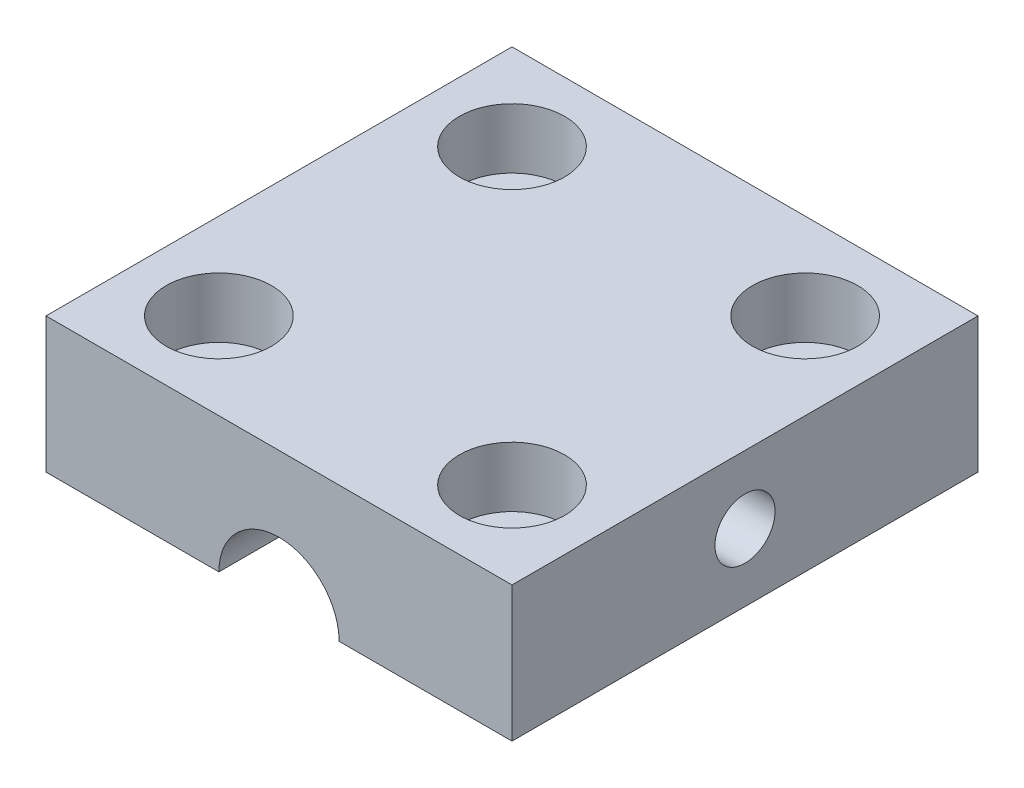
ISO-10303-21;
HEADER;
FILE_DESCRIPTION(('STEP AP214'),'2;1');
FILE_NAME('part.step','',(''),(''),'','','');
FILE_SCHEMA(('AUTOMOTIVE_DESIGN { 1 0 10303 214 1 1 1 1 }'));
ENDSEC;
DATA;
#1=APPLICATION_CONTEXT('core data for automotive mechanical design processes');
#2=APPLICATION_PROTOCOL_DEFINITION('international standard','automotive_design',2000,#1);
#3=PRODUCT_CONTEXT('',#1,'mechanical');
#4=PRODUCT('Part','Part','',(#3));
#5=PRODUCT_RELATED_PRODUCT_CATEGORY('part','',(#4));
#6=PRODUCT_DEFINITION_FORMATION('','',#4);
#7=PRODUCT_DEFINITION_CONTEXT('part definition',#1,'design');
#8=PRODUCT_DEFINITION('design','',#6,#7);
#9=PRODUCT_DEFINITION_SHAPE('','',#8);
#10=(LENGTH_UNIT() NAMED_UNIT(*) SI_UNIT(.MILLI.,.METRE.));
#11=(NAMED_UNIT(*) PLANE_ANGLE_UNIT() SI_UNIT($,.RADIAN.));
#12=(NAMED_UNIT(*) SI_UNIT($,.STERADIAN.) SOLID_ANGLE_UNIT());
#13=UNCERTAINTY_MEASURE_WITH_UNIT(LENGTH_MEASURE(1.E-05),#10,'distance_accuracy_value','');
#14=(GEOMETRIC_REPRESENTATION_CONTEXT(3) GLOBAL_UNCERTAINTY_ASSIGNED_CONTEXT((#13)) GLOBAL_UNIT_ASSIGNED_CONTEXT((#10,
#11,#12)) REPRESENTATION_CONTEXT('',''));
#15=CARTESIAN_POINT('',(0.,0.,0.));
#16=DIRECTION('',(0.,0.,1.));
#17=DIRECTION('',(1.,0.,0.));
#18=AXIS2_PLACEMENT_3D('',#15,#16,#17);
#19=CARTESIAN_POINT('',(-15.5,-4.5,31.));
#20=DIRECTION('',(1.,0.,0.));
#21=DIRECTION('',(0.,0.,-1.));
#22=AXIS2_PLACEMENT_3D('',#19,#20,#21);
#23=PLANE('',#22);
#24=DIRECTION('',(0.,-1.,0.));
#25=VECTOR('',#24,1.);
#26=CARTESIAN_POINT('',(-15.5,-4.5,0.));
#27=LINE('',#26,#25);
#28=CARTESIAN_POINT('',(-15.5,4.5,0.));
#29=VERTEX_POINT('',#28);
#30=CARTESIAN_POINT('',(-15.5,-4.5,0.));
#31=VERTEX_POINT('',#30);
#32=EDGE_CURVE('E136',#29,#31,#27,.T.);
#33=ORIENTED_EDGE('',*,*,#32,.T.);
#34=DIRECTION('',(0.,0.,-1.));
#35=VECTOR('',#34,1.);
#36=CARTESIAN_POINT('',(-15.5,-4.5,31.));
#37=LINE('',#36,#35);
#38=CARTESIAN_POINT('',(-15.5,-4.5,31.));
#39=VERTEX_POINT('',#38);
#40=EDGE_CURVE('E11',#39,#31,#37,.T.);
#41=ORIENTED_EDGE('',*,*,#40,.F.);
#42=DIRECTION('',(0.,-1.,0.));
#43=VECTOR('',#42,1.);
#44=CARTESIAN_POINT('',(-15.5,-4.5,31.));
#45=LINE('',#44,#43);
#46=CARTESIAN_POINT('',(-15.5,4.5,31.));
#47=VERTEX_POINT('',#46);
#48=EDGE_CURVE('E153',#47,#39,#45,.T.);
#49=ORIENTED_EDGE('',*,*,#48,.F.);
#50=DIRECTION('',(0.,0.,-1.));
#51=VECTOR('',#50,1.);
#52=CARTESIAN_POINT('',(-15.5,4.5,31.));
#53=LINE('',#52,#51);
#54=EDGE_CURVE('E132',#47,#29,#53,.T.);
#55=ORIENTED_EDGE('',*,*,#54,.T.);
#56=EDGE_LOOP('',(#33,#41,#49,#55));
#57=FACE_BOUND('',#56,.T.);
#58=ADVANCED_FACE('F45',(#57),#23,.F.);
#59=CARTESIAN_POINT('',(-4.,-4.5,31.));
#60=DIRECTION('',(0.,1.,0.));
#61=DIRECTION('',(0.,0.,1.));
#62=AXIS2_PLACEMENT_3D('',#59,#60,#61);
#63=PLANE('',#62);
#64=CARTESIAN_POINT('',(-9.75,-4.5,25.25));
#65=DIRECTION('',(0.,1.,0.));
#66=DIRECTION('',(0.,0.,1.));
#67=AXIS2_PLACEMENT_3D('',#64,#65,#66);
#68=CIRCLE('',#67,2.);
#69=CARTESIAN_POINT('',(-9.75,-4.5,27.25));
#70=VERTEX_POINT('',#69);
#71=EDGE_CURVE('E274',#70,#70,#68,.T.);
#72=ORIENTED_EDGE('',*,*,#71,.T.);
#73=EDGE_LOOP('',(#72));
#74=FACE_BOUND('',#73,.T.);
#75=CARTESIAN_POINT('',(-9.75,-4.5,5.75));
#76=DIRECTION('',(0.,1.,0.));
#77=DIRECTION('',(0.,0.,1.));
#78=AXIS2_PLACEMENT_3D('',#75,#76,#77);
#79=CIRCLE('',#78,2.);
#80=CARTESIAN_POINT('',(-9.75,-4.5,7.75));
#81=VERTEX_POINT('',#80);
#82=EDGE_CURVE('E271',#81,#81,#79,.T.);
#83=ORIENTED_EDGE('',*,*,#82,.T.);
#84=EDGE_LOOP('',(#83));
#85=FACE_BOUND('',#84,.T.);
#86=DIRECTION('',(1.,0.,0.));
#87=VECTOR('',#86,1.);
#88=CARTESIAN_POINT('',(-4.,-4.5,0.));
#89=LINE('',#88,#87);
#90=CARTESIAN_POINT('',(-4.,-4.5,0.));
#91=VERTEX_POINT('',#90);
#92=EDGE_CURVE('E140',#31,#91,#89,.T.);
#93=ORIENTED_EDGE('',*,*,#92,.T.);
#94=DIRECTION('',(0.,0.,-1.));
#95=VECTOR('',#94,1.);
#96=CARTESIAN_POINT('',(-4.,-4.5,31.));
#97=LINE('',#96,#95);
#98=CARTESIAN_POINT('',(-4.,-4.5,31.));
#99=VERTEX_POINT('',#98);
#100=EDGE_CURVE('E55',#99,#91,#97,.T.);
#101=ORIENTED_EDGE('',*,*,#100,.F.);
#102=DIRECTION('',(1.,0.,0.));
#103=VECTOR('',#102,1.);
#104=CARTESIAN_POINT('',(-4.,-4.5,31.));
#105=LINE('',#104,#103);
#106=EDGE_CURVE('E101',#39,#99,#105,.T.);
#107=ORIENTED_EDGE('',*,*,#106,.F.);
#108=ORIENTED_EDGE('',*,*,#40,.T.);
#109=EDGE_LOOP('',(#93,#101,#107,#108));
#110=FACE_BOUND('',#109,.T.);
#111=ADVANCED_FACE('F221',(#74,#85,#110),#63,.F.);
#112=CARTESIAN_POINT('',(0.,-4.5,31.));
#113=DIRECTION('',(0.,0.,-1.));
#114=DIRECTION('',(-1.,0.,0.));
#115=AXIS2_PLACEMENT_3D('',#112,#113,#114);
#116=CYLINDRICAL_SURFACE('',#115,4.);
#117=CARTESIAN_POINT('',(0.,-4.5,0.));
#118=DIRECTION('',(0.,0.,-1.));
#119=DIRECTION('',(1.,0.,0.));
#120=AXIS2_PLACEMENT_3D('',#117,#118,#119);
#121=CIRCLE('',#120,4.);
#122=CARTESIAN_POINT('',(4.,-4.5,0.));
#123=VERTEX_POINT('',#122);
#124=EDGE_CURVE('E144',#91,#123,#121,.T.);
#125=ORIENTED_EDGE('',*,*,#124,.T.);
#126=DIRECTION('',(0.,0.,-1.));
#127=VECTOR('',#126,1.);
#128=CARTESIAN_POINT('',(4.,-4.5,31.));
#129=LINE('',#128,#127);
#130=CARTESIAN_POINT('',(4.,-4.5,31.));
#131=VERTEX_POINT('',#130);
#132=EDGE_CURVE('E125',#131,#123,#129,.T.);
#133=ORIENTED_EDGE('',*,*,#132,.F.);
#134=CARTESIAN_POINT('',(0.,-4.5,31.));
#135=DIRECTION('',(0.,0.,-1.));
#136=DIRECTION('',(1.,0.,0.));
#137=AXIS2_PLACEMENT_3D('',#134,#135,#136);
#138=CIRCLE('',#137,4.);
#139=EDGE_CURVE('E114',#99,#131,#138,.T.);
#140=ORIENTED_EDGE('',*,*,#139,.F.);
#141=ORIENTED_EDGE('',*,*,#100,.T.);
#142=EDGE_LOOP('',(#125,#133,#140,#141));
#143=FACE_BOUND('',#142,.T.);
#144=ADVANCED_FACE('F224',(#143),#116,.F.);
#145=CARTESIAN_POINT('',(15.5,-4.5,31.));
#146=DIRECTION('',(0.,1.,0.));
#147=DIRECTION('',(0.,0.,1.));
#148=AXIS2_PLACEMENT_3D('',#145,#146,#147);
#149=PLANE('',#148);
#150=CARTESIAN_POINT('',(9.75,-4.5,25.25));
#151=DIRECTION('',(0.,1.,0.));
#152=DIRECTION('',(0.,0.,1.));
#153=AXIS2_PLACEMENT_3D('',#150,#151,#152);
#154=CIRCLE('',#153,2.);
#155=CARTESIAN_POINT('',(9.75,-4.5,27.25));
#156=VERTEX_POINT('',#155);
#157=EDGE_CURVE('E266',#156,#156,#154,.T.);
#158=ORIENTED_EDGE('',*,*,#157,.T.);
#159=EDGE_LOOP('',(#158));
#160=FACE_BOUND('',#159,.T.);
#161=CARTESIAN_POINT('',(9.75,-4.5,5.75));
#162=DIRECTION('',(0.,1.,0.));
#163=DIRECTION('',(0.,0.,1.));
#164=AXIS2_PLACEMENT_3D('',#161,#162,#163);
#165=CIRCLE('',#164,2.);
#166=CARTESIAN_POINT('',(9.75,-4.5,7.75));
#167=VERTEX_POINT('',#166);
#168=EDGE_CURVE('E168',#167,#167,#165,.T.);
#169=ORIENTED_EDGE('',*,*,#168,.T.);
#170=EDGE_LOOP('',(#169));
#171=FACE_BOUND('',#170,.T.);
#172=DIRECTION('',(1.,0.,0.));
#173=VECTOR('',#172,1.);
#174=CARTESIAN_POINT('',(15.5,-4.5,0.));
#175=LINE('',#174,#173);
#176=CARTESIAN_POINT('',(15.5,-4.5,0.));
#177=VERTEX_POINT('',#176);
#178=EDGE_CURVE('E123',#123,#177,#175,.T.);
#179=ORIENTED_EDGE('',*,*,#178,.T.);
#180=DIRECTION('',(0.,0.,-1.));
#181=VECTOR('',#180,1.);
#182=CARTESIAN_POINT('',(15.5,-4.5,31.));
#183=LINE('',#182,#181);
#184=CARTESIAN_POINT('',(15.5,-4.5,31.));
#185=VERTEX_POINT('',#184);
#186=EDGE_CURVE('E120',#185,#177,#183,.T.);
#187=ORIENTED_EDGE('',*,*,#186,.F.);
#188=DIRECTION('',(1.,0.,0.));
#189=VECTOR('',#188,1.);
#190=CARTESIAN_POINT('',(15.5,-4.5,31.));
#191=LINE('',#190,#189);
#192=EDGE_CURVE('E108',#131,#185,#191,.T.);
#193=ORIENTED_EDGE('',*,*,#192,.F.);
#194=ORIENTED_EDGE('',*,*,#132,.T.);
#195=EDGE_LOOP('',(#179,#187,#193,#194));
#196=FACE_BOUND('',#195,.T.);
#197=ADVANCED_FACE('F121',(#160,#171,#196),#149,.F.);
#198=CARTESIAN_POINT('',(15.5,-4.5,31.));
#199=DIRECTION('',(-1.,0.,0.));
#200=DIRECTION('',(0.,0.,1.));
#201=AXIS2_PLACEMENT_3D('',#198,#199,#200);
#202=PLANE('',#201);
#203=CARTESIAN_POINT('',(15.5,0.,15.5));
#204=DIRECTION('',(1.,0.,0.));
#205=DIRECTION('',(0.,0.,-1.));
#206=AXIS2_PLACEMENT_3D('',#203,#204,#205);
#207=CIRCLE('',#206,2.);
#208=CARTESIAN_POINT('',(15.5,0.,13.5));
#209=VERTEX_POINT('',#208);
#210=EDGE_CURVE('E282',#209,#209,#207,.T.);
#211=ORIENTED_EDGE('',*,*,#210,.F.);
#212=EDGE_LOOP('',(#211));
#213=FACE_BOUND('',#212,.T.);
#214=DIRECTION('',(0.,1.,0.));
#215=VECTOR('',#214,1.);
#216=CARTESIAN_POINT('',(15.5,-4.5,0.));
#217=LINE('',#216,#215);
#218=CARTESIAN_POINT('',(15.5,4.5,0.));
#219=VERTEX_POINT('',#218);
#220=EDGE_CURVE('E87',#177,#219,#217,.T.);
#221=ORIENTED_EDGE('',*,*,#220,.T.);
#222=DIRECTION('',(0.,0.,-1.));
#223=VECTOR('',#222,1.);
#224=CARTESIAN_POINT('',(15.5,4.5,31.));
#225=LINE('',#224,#223);
#226=CARTESIAN_POINT('',(15.5,4.5,31.));
#227=VERTEX_POINT('',#226);
#228=EDGE_CURVE('E126',#227,#219,#225,.T.);
#229=ORIENTED_EDGE('',*,*,#228,.F.);
#230=DIRECTION('',(0.,1.,0.));
#231=VECTOR('',#230,1.);
#232=CARTESIAN_POINT('',(15.5,-4.5,31.));
#233=LINE('',#232,#231);
#234=EDGE_CURVE('E112',#185,#227,#233,.T.);
#235=ORIENTED_EDGE('',*,*,#234,.F.);
#236=ORIENTED_EDGE('',*,*,#186,.T.);
#237=EDGE_LOOP('',(#221,#229,#235,#236));
#238=FACE_BOUND('',#237,.T.);
#239=ADVANCED_FACE('F128',(#213,#238),#202,.F.);
#240=CARTESIAN_POINT('',(15.5,4.5,31.));
#241=DIRECTION('',(0.,-1.,0.));
#242=DIRECTION('',(0.,0.,-1.));
#243=AXIS2_PLACEMENT_3D('',#240,#241,#242);
#244=PLANE('',#243);
#245=CARTESIAN_POINT('',(9.75,4.5,25.25));
#246=DIRECTION('',(0.,1.,0.));
#247=DIRECTION('',(0.,0.,-1.));
#248=AXIS2_PLACEMENT_3D('',#245,#246,#247);
#249=CIRCLE('',#248,3.5);
#250=CARTESIAN_POINT('',(9.75,4.5,21.75));
#251=VERTEX_POINT('',#250);
#252=EDGE_CURVE('E193',#251,#251,#249,.T.);
#253=ORIENTED_EDGE('',*,*,#252,.F.);
#254=EDGE_LOOP('',(#253));
#255=FACE_BOUND('',#254,.T.);
#256=CARTESIAN_POINT('',(-9.75,4.5,5.75));
#257=DIRECTION('',(0.,1.,0.));
#258=DIRECTION('',(0.,0.,-1.));
#259=AXIS2_PLACEMENT_3D('',#256,#257,#258);
#260=CIRCLE('',#259,3.5);
#261=CARTESIAN_POINT('',(-9.75,4.5,2.25));
#262=VERTEX_POINT('',#261);
#263=EDGE_CURVE('E202',#262,#262,#260,.T.);
#264=ORIENTED_EDGE('',*,*,#263,.F.);
#265=EDGE_LOOP('',(#264));
#266=FACE_BOUND('',#265,.T.);
#267=CARTESIAN_POINT('',(-9.75,4.5,25.25));
#268=DIRECTION('',(0.,1.,0.));
#269=DIRECTION('',(0.,0.,1.));
#270=AXIS2_PLACEMENT_3D('',#267,#268,#269);
#271=CIRCLE('',#270,3.5);
#272=CARTESIAN_POINT('',(-9.75,4.5,28.75));
#273=VERTEX_POINT('',#272);
#274=EDGE_CURVE('E183',#273,#273,#271,.T.);
#275=ORIENTED_EDGE('',*,*,#274,.F.);
#276=EDGE_LOOP('',(#275));
#277=FACE_BOUND('',#276,.T.);
#278=CARTESIAN_POINT('',(9.75,4.5,5.75));
#279=DIRECTION('',(0.,1.,0.));
#280=DIRECTION('',(0.,0.,1.));
#281=AXIS2_PLACEMENT_3D('',#278,#279,#280);
#282=CIRCLE('',#281,3.5);
#283=CARTESIAN_POINT('',(9.75,4.5,9.25));
#284=VERTEX_POINT('',#283);
#285=EDGE_CURVE('E197',#284,#284,#282,.T.);
#286=ORIENTED_EDGE('',*,*,#285,.F.);
#287=EDGE_LOOP('',(#286));
#288=FACE_BOUND('',#287,.T.);
#289=DIRECTION('',(-1.,0.,0.));
#290=VECTOR('',#289,1.);
#291=CARTESIAN_POINT('',(15.5,4.5,0.));
#292=LINE('',#291,#290);
#293=EDGE_CURVE('E93',#219,#29,#292,.T.);
#294=ORIENTED_EDGE('',*,*,#293,.T.);
#295=ORIENTED_EDGE('',*,*,#54,.F.);
#296=DIRECTION('',(-1.,0.,0.));
#297=VECTOR('',#296,1.);
#298=CARTESIAN_POINT('',(15.5,4.5,31.));
#299=LINE('',#298,#297);
#300=EDGE_CURVE('E64',#227,#47,#299,.T.);
#301=ORIENTED_EDGE('',*,*,#300,.F.);
#302=ORIENTED_EDGE('',*,*,#228,.T.);
#303=EDGE_LOOP('',(#294,#295,#301,#302));
#304=FACE_BOUND('',#303,.T.);
#305=ADVANCED_FACE('F229',(#255,#266,#277,#288,#304),#244,.F.);
#306=CARTESIAN_POINT('',(0.,-4.5,31.));
#307=DIRECTION('',(0.,0.,1.));
#308=DIRECTION('',(1.,0.,0.));
#309=AXIS2_PLACEMENT_3D('',#306,#307,#308);
#310=PLANE('',#309);
#311=ORIENTED_EDGE('',*,*,#48,.T.);
#312=ORIENTED_EDGE('',*,*,#106,.T.);
#313=ORIENTED_EDGE('',*,*,#139,.T.);
#314=ORIENTED_EDGE('',*,*,#192,.T.);
#315=ORIENTED_EDGE('',*,*,#234,.T.);
#316=ORIENTED_EDGE('',*,*,#300,.T.);
#317=EDGE_LOOP('',(#311,#312,#313,#314,#315,#316));
#318=FACE_BOUND('',#317,.T.);
#319=ADVANCED_FACE('F110',(#318),#310,.T.);
#320=CARTESIAN_POINT('',(0.,-4.5,0.));
#321=DIRECTION('',(0.,0.,1.));
#322=DIRECTION('',(1.,0.,0.));
#323=AXIS2_PLACEMENT_3D('',#320,#321,#322);
#324=PLANE('',#323);
#325=ORIENTED_EDGE('',*,*,#32,.F.);
#326=ORIENTED_EDGE('',*,*,#293,.F.);
#327=ORIENTED_EDGE('',*,*,#220,.F.);
#328=ORIENTED_EDGE('',*,*,#178,.F.);
#329=ORIENTED_EDGE('',*,*,#124,.F.);
#330=ORIENTED_EDGE('',*,*,#92,.F.);
#331=EDGE_LOOP('',(#325,#326,#327,#328,#329,#330));
#332=FACE_BOUND('',#331,.T.);
#333=ADVANCED_FACE('F227',(#332),#324,.F.);
#334=CARTESIAN_POINT('',(9.75,0.5,5.75));
#335=DIRECTION('',(0.,1.,0.));
#336=DIRECTION('',(0.,0.,1.));
#337=AXIS2_PLACEMENT_3D('',#334,#335,#336);
#338=CYLINDRICAL_SURFACE('',#337,3.5);
#339=CARTESIAN_POINT('',(9.75,0.5,5.75));
#340=DIRECTION('',(0.,1.,0.));
#341=DIRECTION('',(0.,0.,1.));
#342=AXIS2_PLACEMENT_3D('',#339,#340,#341);
#343=CIRCLE('',#342,3.5);
#344=CARTESIAN_POINT('',(9.75,0.5,9.25));
#345=VERTEX_POINT('',#344);
#346=EDGE_CURVE('E141',#345,#345,#343,.T.);
#347=ORIENTED_EDGE('',*,*,#346,.F.);
#348=EDGE_LOOP('',(#347));
#349=FACE_BOUND('',#348,.T.);
#350=ORIENTED_EDGE('',*,*,#285,.T.);
#351=EDGE_LOOP('',(#350));
#352=FACE_BOUND('',#351,.T.);
#353=ADVANCED_FACE('F341',(#349,#352),#338,.F.);
#354=CARTESIAN_POINT('',(9.75,0.5,5.75));
#355=DIRECTION('',(0.,1.,0.));
#356=DIRECTION('',(0.,0.,1.));
#357=AXIS2_PLACEMENT_3D('',#354,#355,#356);
#358=PLANE('',#357);
#359=CARTESIAN_POINT('',(9.75,0.5,5.75));
#360=DIRECTION('',(0.,1.,0.));
#361=DIRECTION('',(0.,0.,1.));
#362=AXIS2_PLACEMENT_3D('',#359,#360,#361);
#363=CIRCLE('',#362,2.);
#364=CARTESIAN_POINT('',(9.75,0.5,7.75));
#365=VERTEX_POINT('',#364);
#366=EDGE_CURVE('E48',#365,#365,#363,.T.);
#367=ORIENTED_EDGE('',*,*,#366,.F.);
#368=EDGE_LOOP('',(#367));
#369=FACE_BOUND('',#368,.T.);
#370=ORIENTED_EDGE('',*,*,#346,.T.);
#371=EDGE_LOOP('',(#370));
#372=FACE_BOUND('',#371,.T.);
#373=ADVANCED_FACE('F321',(#369,#372),#358,.T.);
#374=CARTESIAN_POINT('',(-9.75,0.5,25.25));
#375=DIRECTION('',(0.,1.,0.));
#376=DIRECTION('',(0.,0.,1.));
#377=AXIS2_PLACEMENT_3D('',#374,#375,#376);
#378=CYLINDRICAL_SURFACE('',#377,3.5);
#379=CARTESIAN_POINT('',(-9.75,0.5,25.25));
#380=DIRECTION('',(0.,1.,0.));
#381=DIRECTION('',(0.,0.,1.));
#382=AXIS2_PLACEMENT_3D('',#379,#380,#381);
#383=CIRCLE('',#382,3.5);
#384=CARTESIAN_POINT('',(-9.75,0.5,28.75));
#385=VERTEX_POINT('',#384);
#386=EDGE_CURVE('E178',#385,#385,#383,.T.);
#387=ORIENTED_EDGE('',*,*,#386,.F.);
#388=EDGE_LOOP('',(#387));
#389=FACE_BOUND('',#388,.T.);
#390=ORIENTED_EDGE('',*,*,#274,.T.);
#391=EDGE_LOOP('',(#390));
#392=FACE_BOUND('',#391,.T.);
#393=ADVANCED_FACE('F317',(#389,#392),#378,.F.);
#394=CARTESIAN_POINT('',(-9.75,0.5,25.25));
#395=DIRECTION('',(0.,1.,0.));
#396=DIRECTION('',(0.,0.,1.));
#397=AXIS2_PLACEMENT_3D('',#394,#395,#396);
#398=PLANE('',#397);
#399=CARTESIAN_POINT('',(-9.75,0.5,25.25));
#400=DIRECTION('',(0.,1.,0.));
#401=DIRECTION('',(0.,0.,1.));
#402=AXIS2_PLACEMENT_3D('',#399,#400,#401);
#403=CIRCLE('',#402,2.);
#404=CARTESIAN_POINT('',(-9.75,0.5,27.25));
#405=VERTEX_POINT('',#404);
#406=EDGE_CURVE('E171',#405,#405,#403,.T.);
#407=ORIENTED_EDGE('',*,*,#406,.F.);
#408=EDGE_LOOP('',(#407));
#409=FACE_BOUND('',#408,.T.);
#410=ORIENTED_EDGE('',*,*,#386,.T.);
#411=EDGE_LOOP('',(#410));
#412=FACE_BOUND('',#411,.T.);
#413=ADVANCED_FACE('F320',(#409,#412),#398,.T.);
#414=CARTESIAN_POINT('',(-9.75,0.5,5.75));
#415=DIRECTION('',(0.,1.,0.));
#416=DIRECTION('',(0.,0.,1.));
#417=AXIS2_PLACEMENT_3D('',#414,#415,#416);
#418=CYLINDRICAL_SURFACE('',#417,3.5);
#419=CARTESIAN_POINT('',(-9.75,0.5,5.75));
#420=DIRECTION('',(0.,1.,0.));
#421=DIRECTION('',(0.,0.,-1.));
#422=AXIS2_PLACEMENT_3D('',#419,#420,#421);
#423=CIRCLE('',#422,3.5);
#424=CARTESIAN_POINT('',(-9.75,0.5,2.25));
#425=VERTEX_POINT('',#424);
#426=EDGE_CURVE('E189',#425,#425,#423,.T.);
#427=ORIENTED_EDGE('',*,*,#426,.F.);
#428=EDGE_LOOP('',(#427));
#429=FACE_BOUND('',#428,.T.);
#430=ORIENTED_EDGE('',*,*,#263,.T.);
#431=EDGE_LOOP('',(#430));
#432=FACE_BOUND('',#431,.T.);
#433=ADVANCED_FACE('F325',(#429,#432),#418,.F.);
#434=CARTESIAN_POINT('',(-9.75,0.5,5.75));
#435=DIRECTION('',(0.,-1.,0.));
#436=DIRECTION('',(0.,0.,-1.));
#437=AXIS2_PLACEMENT_3D('',#434,#435,#436);
#438=PLANE('',#437);
#439=CARTESIAN_POINT('',(-9.75,0.5,5.75));
#440=DIRECTION('',(0.,-1.,0.));
#441=DIRECTION('',(0.,0.,-1.));
#442=AXIS2_PLACEMENT_3D('',#439,#440,#441);
#443=CIRCLE('',#442,2.);
#444=CARTESIAN_POINT('',(-9.75,0.5,3.75));
#445=VERTEX_POINT('',#444);
#446=EDGE_CURVE('E167',#445,#445,#443,.T.);
#447=ORIENTED_EDGE('',*,*,#446,.T.);
#448=EDGE_LOOP('',(#447));
#449=FACE_BOUND('',#448,.T.);
#450=ORIENTED_EDGE('',*,*,#426,.T.);
#451=EDGE_LOOP('',(#450));
#452=FACE_BOUND('',#451,.T.);
#453=ADVANCED_FACE('F329',(#449,#452),#438,.F.);
#454=CARTESIAN_POINT('',(9.75,0.5,25.25));
#455=DIRECTION('',(0.,1.,0.));
#456=DIRECTION('',(0.,0.,1.));
#457=AXIS2_PLACEMENT_3D('',#454,#455,#456);
#458=CYLINDRICAL_SURFACE('',#457,3.5);
#459=CARTESIAN_POINT('',(9.75,0.5,25.25));
#460=DIRECTION('',(0.,1.,0.));
#461=DIRECTION('',(0.,0.,-1.));
#462=AXIS2_PLACEMENT_3D('',#459,#460,#461);
#463=CIRCLE('',#462,3.5);
#464=CARTESIAN_POINT('',(9.75,0.5,21.75));
#465=VERTEX_POINT('',#464);
#466=EDGE_CURVE('E198',#465,#465,#463,.T.);
#467=ORIENTED_EDGE('',*,*,#466,.F.);
#468=EDGE_LOOP('',(#467));
#469=FACE_BOUND('',#468,.T.);
#470=ORIENTED_EDGE('',*,*,#252,.T.);
#471=EDGE_LOOP('',(#470));
#472=FACE_BOUND('',#471,.T.);
#473=ADVANCED_FACE('F327',(#469,#472),#458,.F.);
#474=CARTESIAN_POINT('',(9.75,0.5,25.25));
#475=DIRECTION('',(0.,-1.,0.));
#476=DIRECTION('',(0.,0.,-1.));
#477=AXIS2_PLACEMENT_3D('',#474,#475,#476);
#478=PLANE('',#477);
#479=CARTESIAN_POINT('',(9.75,0.5,25.25));
#480=DIRECTION('',(0.,-1.,0.));
#481=DIRECTION('',(0.,0.,-1.));
#482=AXIS2_PLACEMENT_3D('',#479,#480,#481);
#483=CIRCLE('',#482,2.);
#484=CARTESIAN_POINT('',(9.75,0.5,23.25));
#485=VERTEX_POINT('',#484);
#486=EDGE_CURVE('E163',#485,#485,#483,.T.);
#487=ORIENTED_EDGE('',*,*,#486,.T.);
#488=EDGE_LOOP('',(#487));
#489=FACE_BOUND('',#488,.T.);
#490=ORIENTED_EDGE('',*,*,#466,.T.);
#491=EDGE_LOOP('',(#490));
#492=FACE_BOUND('',#491,.T.);
#493=ADVANCED_FACE('F314',(#489,#492),#478,.F.);
#494=CARTESIAN_POINT('',(9.75,-4.5,25.25));
#495=DIRECTION('',(0.,1.,0.));
#496=DIRECTION('',(0.,0.,1.));
#497=AXIS2_PLACEMENT_3D('',#494,#495,#496);
#498=CYLINDRICAL_SURFACE('',#497,2.);
#499=ORIENTED_EDGE('',*,*,#157,.F.);
#500=EDGE_LOOP('',(#499));
#501=FACE_BOUND('',#500,.T.);
#502=ORIENTED_EDGE('',*,*,#486,.F.);
#503=EDGE_LOOP('',(#502));
#504=FACE_BOUND('',#503,.T.);
#505=ADVANCED_FACE('F309',(#501,#504),#498,.F.);
#506=CARTESIAN_POINT('',(-9.75,-4.5,5.75));
#507=DIRECTION('',(0.,1.,0.));
#508=DIRECTION('',(0.,0.,1.));
#509=AXIS2_PLACEMENT_3D('',#506,#507,#508);
#510=CYLINDRICAL_SURFACE('',#509,2.);
#511=ORIENTED_EDGE('',*,*,#82,.F.);
#512=EDGE_LOOP('',(#511));
#513=FACE_BOUND('',#512,.T.);
#514=ORIENTED_EDGE('',*,*,#446,.F.);
#515=EDGE_LOOP('',(#514));
#516=FACE_BOUND('',#515,.T.);
#517=ADVANCED_FACE('F306',(#513,#516),#510,.F.);
#518=CARTESIAN_POINT('',(-9.75,-4.5,25.25));
#519=DIRECTION('',(0.,1.,0.));
#520=DIRECTION('',(0.,0.,1.));
#521=AXIS2_PLACEMENT_3D('',#518,#519,#520);
#522=CYLINDRICAL_SURFACE('',#521,2.);
#523=ORIENTED_EDGE('',*,*,#406,.T.);
#524=EDGE_LOOP('',(#523));
#525=FACE_BOUND('',#524,.T.);
#526=ORIENTED_EDGE('',*,*,#71,.F.);
#527=EDGE_LOOP('',(#526));
#528=FACE_BOUND('',#527,.T.);
#529=ADVANCED_FACE('F303',(#525,#528),#522,.F.);
#530=CARTESIAN_POINT('',(9.75,-4.5,5.75));
#531=DIRECTION('',(0.,1.,0.));
#532=DIRECTION('',(0.,0.,1.));
#533=AXIS2_PLACEMENT_3D('',#530,#531,#532);
#534=CYLINDRICAL_SURFACE('',#533,2.);
#535=ORIENTED_EDGE('',*,*,#366,.T.);
#536=EDGE_LOOP('',(#535));
#537=FACE_BOUND('',#536,.T.);
#538=ORIENTED_EDGE('',*,*,#168,.F.);
#539=EDGE_LOOP('',(#538));
#540=FACE_BOUND('',#539,.T.);
#541=ADVANCED_FACE('F295',(#537,#540),#534,.F.);
#542=CARTESIAN_POINT('',(5.5,0.,15.5));
#543=DIRECTION('',(1.,0.,0.));
#544=DIRECTION('',(0.,0.,-1.));
#545=AXIS2_PLACEMENT_3D('',#542,#543,#544);
#546=CYLINDRICAL_SURFACE('',#545,2.);
#547=CARTESIAN_POINT('',(5.5,0.,15.5));
#548=DIRECTION('',(1.,0.,0.));
#549=DIRECTION('',(0.,0.,-1.));
#550=AXIS2_PLACEMENT_3D('',#547,#548,#549);
#551=CIRCLE('',#550,2.);
#552=CARTESIAN_POINT('',(5.5,0.,13.5));
#553=VERTEX_POINT('',#552);
#554=EDGE_CURVE('E279',#553,#553,#551,.T.);
#555=ORIENTED_EDGE('',*,*,#554,.F.);
#556=EDGE_LOOP('',(#555));
#557=FACE_BOUND('',#556,.T.);
#558=ORIENTED_EDGE('',*,*,#210,.T.);
#559=EDGE_LOOP('',(#558));
#560=FACE_BOUND('',#559,.T.);
#561=ADVANCED_FACE('F292',(#557,#560),#546,.F.);
#562=CARTESIAN_POINT('',(5.5,0.,15.5));
#563=DIRECTION('',(1.,0.,0.));
#564=DIRECTION('',(0.,0.,-1.));
#565=AXIS2_PLACEMENT_3D('',#562,#563,#564);
#566=PLANE('',#565);
#567=ORIENTED_EDGE('',*,*,#554,.T.);
#568=EDGE_LOOP('',(#567));
#569=FACE_BOUND('',#568,.T.);
#570=ADVANCED_FACE('F290',(#569),#566,.T.);
#571=CLOSED_SHELL('',(#58,#111,#144,#197,#239,#305,#319,#333,#353,#373,#393,#413,#433,#453,#473,
#493,#505,#517,#529,#541,#561,#570));
#572=MANIFOLD_SOLID_BREP('B2',#571);
#573=ADVANCED_BREP_SHAPE_REPRESENTATION('',(#18,#572),#14);
#574=SHAPE_DEFINITION_REPRESENTATION(#9,#573);
ENDSEC;
END-ISO-10303-21;
